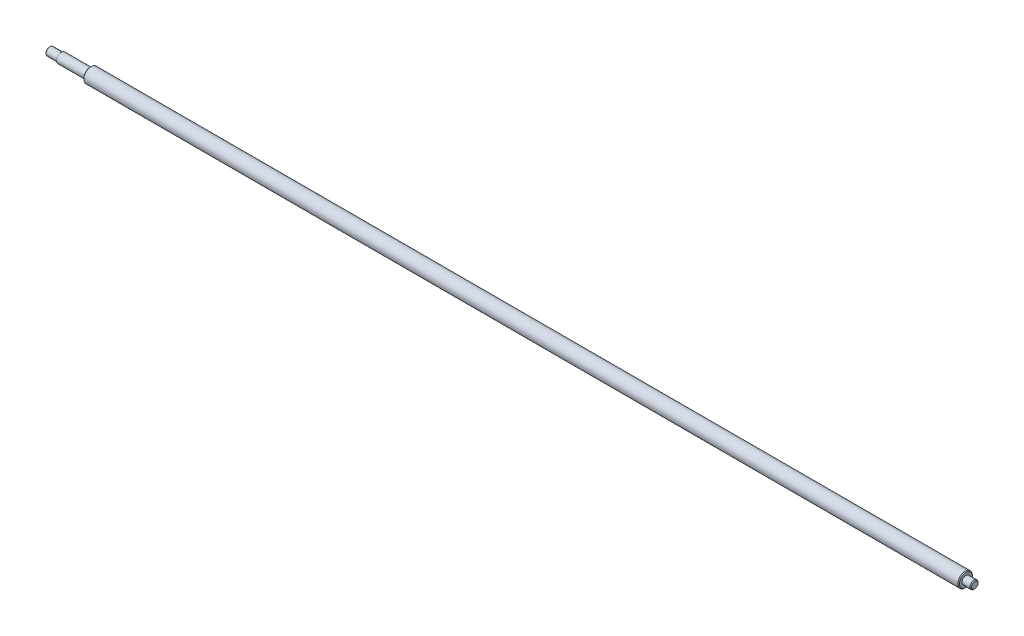
ISO-10303-21;
HEADER;
FILE_DESCRIPTION(('STEP AP214'),'2;1');
FILE_NAME('part.step','',(''),(''),'','','');
FILE_SCHEMA(('AUTOMOTIVE_DESIGN { 1 0 10303 214 1 1 1 1 }'));
ENDSEC;
DATA;
#1=APPLICATION_CONTEXT('core data for automotive mechanical design processes');
#2=APPLICATION_PROTOCOL_DEFINITION('international standard','automotive_design',2000,#1);
#3=PRODUCT_CONTEXT('',#1,'mechanical');
#4=PRODUCT('Part','Part','',(#3));
#5=PRODUCT_RELATED_PRODUCT_CATEGORY('part','',(#4));
#6=PRODUCT_DEFINITION_FORMATION('','',#4);
#7=PRODUCT_DEFINITION_CONTEXT('part definition',#1,'design');
#8=PRODUCT_DEFINITION('design','',#6,#7);
#9=PRODUCT_DEFINITION_SHAPE('','',#8);
#10=(LENGTH_UNIT() NAMED_UNIT(*) SI_UNIT(.MILLI.,.METRE.));
#11=(NAMED_UNIT(*) PLANE_ANGLE_UNIT() SI_UNIT($,.RADIAN.));
#12=(NAMED_UNIT(*) SI_UNIT($,.STERADIAN.) SOLID_ANGLE_UNIT());
#13=UNCERTAINTY_MEASURE_WITH_UNIT(LENGTH_MEASURE(1.E-05),#10,'distance_accuracy_value','');
#14=(GEOMETRIC_REPRESENTATION_CONTEXT(3) GLOBAL_UNCERTAINTY_ASSIGNED_CONTEXT((#13)) GLOBAL_UNIT_ASSIGNED_CONTEXT((#10,
#11,#12)) REPRESENTATION_CONTEXT('',''));
#15=CARTESIAN_POINT('',(0.,0.,0.));
#16=DIRECTION('',(0.,0.,1.));
#17=DIRECTION('',(1.,0.,0.));
#18=AXIS2_PLACEMENT_3D('',#15,#16,#17);
#19=CARTESIAN_POINT('',(-208.466913464529,0.,0.));
#20=DIRECTION('',(1.,0.,0.));
#21=DIRECTION('',(0.,0.,-1.));
#22=AXIS2_PLACEMENT_3D('',#19,#20,#21);
#23=PLANE('',#22);
#24=CARTESIAN_POINT('',(-208.466913464529,0.,0.));
#25=DIRECTION('',(-1.,0.,0.));
#26=DIRECTION('',(0.,0.,1.));
#27=AXIS2_PLACEMENT_3D('',#24,#25,#26);
#28=CIRCLE('',#27,4.);
#29=CARTESIAN_POINT('',(-208.466913464529,0.,4.));
#30=VERTEX_POINT('',#29);
#31=EDGE_CURVE('E10',#30,#30,#28,.T.);
#32=ORIENTED_EDGE('',*,*,#31,.T.);
#33=EDGE_LOOP('',(#32));
#34=FACE_BOUND('',#33,.T.);
#35=ADVANCED_FACE('F30',(#34),#23,.F.);
#36=CARTESIAN_POINT('',(-207.466913464529,0.,0.));
#37=DIRECTION('',(1.,0.,0.));
#38=DIRECTION('',(0.,0.,-1.));
#39=AXIS2_PLACEMENT_3D('',#36,#37,#38);
#40=CONICAL_SURFACE('',#39,5.,0.785398163397448);
#41=ORIENTED_EDGE('',*,*,#31,.F.);
#42=EDGE_LOOP('',(#41));
#43=FACE_BOUND('',#42,.T.);
#44=CARTESIAN_POINT('',(-207.466913464529,0.,0.));
#45=DIRECTION('',(-1.,0.,0.));
#46=DIRECTION('',(0.,0.,1.));
#47=AXIS2_PLACEMENT_3D('',#44,#45,#46);
#48=CIRCLE('',#47,5.);
#49=CARTESIAN_POINT('',(-207.466913464529,0.,5.));
#50=VERTEX_POINT('',#49);
#51=EDGE_CURVE('E36',#50,#50,#48,.T.);
#52=ORIENTED_EDGE('',*,*,#51,.T.);
#53=EDGE_LOOP('',(#52));
#54=FACE_BOUND('',#53,.T.);
#55=ADVANCED_FACE('F86',(#43,#54),#40,.T.);
#56=CARTESIAN_POINT('',(-222.964145739585,0.,0.));
#57=DIRECTION('',(-1.,0.,0.));
#58=DIRECTION('',(0.,0.,1.));
#59=AXIS2_PLACEMENT_3D('',#56,#57,#58);
#60=CYLINDRICAL_SURFACE('',#59,5.);
#61=ORIENTED_EDGE('',*,*,#51,.F.);
#62=EDGE_LOOP('',(#61));
#63=FACE_BOUND('',#62,.T.);
#64=CARTESIAN_POINT('',(-193.466913464529,0.,0.));
#65=DIRECTION('',(-1.,0.,0.));
#66=DIRECTION('',(0.,0.,1.));
#67=AXIS2_PLACEMENT_3D('',#64,#65,#66);
#68=CIRCLE('',#67,5.);
#69=CARTESIAN_POINT('',(-193.466913464529,0.,5.));
#70=VERTEX_POINT('',#69);
#71=EDGE_CURVE('E40',#70,#70,#68,.T.);
#72=ORIENTED_EDGE('',*,*,#71,.T.);
#73=EDGE_LOOP('',(#72));
#74=FACE_BOUND('',#73,.T.);
#75=ADVANCED_FACE('F90',(#63,#74),#60,.T.);
#76=CARTESIAN_POINT('',(-193.466913464529,0.,-5.));
#77=DIRECTION('',(1.,0.,0.));
#78=DIRECTION('',(0.,0.,-1.));
#79=AXIS2_PLACEMENT_3D('',#76,#77,#78);
#80=PLANE('',#79);
#81=ORIENTED_EDGE('',*,*,#71,.F.);
#82=EDGE_LOOP('',(#81));
#83=FACE_BOUND('',#82,.T.);
#84=CARTESIAN_POINT('',(-193.466913464529,0.,0.));
#85=DIRECTION('',(-1.,0.,0.));
#86=DIRECTION('',(0.,0.,1.));
#87=AXIS2_PLACEMENT_3D('',#84,#85,#86);
#88=CIRCLE('',#87,6.);
#89=CARTESIAN_POINT('',(-193.466913464529,0.,6.));
#90=VERTEX_POINT('',#89);
#91=EDGE_CURVE('E44',#90,#90,#88,.T.);
#92=ORIENTED_EDGE('',*,*,#91,.T.);
#93=EDGE_LOOP('',(#92));
#94=FACE_BOUND('',#93,.T.);
#95=ADVANCED_FACE('F95',(#83,#94),#80,.F.);
#96=CARTESIAN_POINT('',(-222.964145739585,0.,0.));
#97=DIRECTION('',(-1.,0.,0.));
#98=DIRECTION('',(0.,0.,1.));
#99=AXIS2_PLACEMENT_3D('',#96,#97,#98);
#100=CYLINDRICAL_SURFACE('',#99,6.);
#101=ORIENTED_EDGE('',*,*,#91,.F.);
#102=EDGE_LOOP('',(#101));
#103=FACE_BOUND('',#102,.T.);
#104=CARTESIAN_POINT('',(-157.466913464529,0.,0.));
#105=DIRECTION('',(-1.,0.,0.));
#106=DIRECTION('',(0.,0.,1.));
#107=AXIS2_PLACEMENT_3D('',#104,#105,#106);
#108=CIRCLE('',#107,6.);
#109=CARTESIAN_POINT('',(-157.466913464529,0.,6.));
#110=VERTEX_POINT('',#109);
#111=EDGE_CURVE('E49',#110,#110,#108,.T.);
#112=ORIENTED_EDGE('',*,*,#111,.T.);
#113=EDGE_LOOP('',(#112));
#114=FACE_BOUND('',#113,.T.);
#115=ADVANCED_FACE('F101',(#103,#114),#100,.T.);
#116=CARTESIAN_POINT('',(-157.466913464529,0.,-6.));
#117=DIRECTION('',(1.,0.,0.));
#118=DIRECTION('',(0.,0.,-1.));
#119=AXIS2_PLACEMENT_3D('',#116,#117,#118);
#120=PLANE('',#119);
#121=ORIENTED_EDGE('',*,*,#111,.F.);
#122=EDGE_LOOP('',(#121));
#123=FACE_BOUND('',#122,.T.);
#124=CARTESIAN_POINT('',(-157.466913464529,0.,0.));
#125=DIRECTION('',(-1.,0.,0.));
#126=DIRECTION('',(0.,0.,1.));
#127=AXIS2_PLACEMENT_3D('',#124,#125,#126);
#128=CIRCLE('',#127,8.);
#129=CARTESIAN_POINT('',(-157.466913464529,0.,8.));
#130=VERTEX_POINT('',#129);
#131=EDGE_CURVE('E52',#130,#130,#128,.T.);
#132=ORIENTED_EDGE('',*,*,#131,.T.);
#133=EDGE_LOOP('',(#132));
#134=FACE_BOUND('',#133,.T.);
#135=ADVANCED_FACE('F105',(#123,#134),#120,.F.);
#136=CARTESIAN_POINT('',(-156.466913464529,0.,0.));
#137=DIRECTION('',(1.,0.,0.));
#138=DIRECTION('',(0.,0.,-1.));
#139=AXIS2_PLACEMENT_3D('',#136,#137,#138);
#140=CONICAL_SURFACE('',#139,9.,0.785398163397447);
#141=ORIENTED_EDGE('',*,*,#131,.F.);
#142=EDGE_LOOP('',(#141));
#143=FACE_BOUND('',#142,.T.);
#144=CARTESIAN_POINT('',(-156.466913464529,0.,0.));
#145=DIRECTION('',(-1.,0.,0.));
#146=DIRECTION('',(0.,0.,1.));
#147=AXIS2_PLACEMENT_3D('',#144,#145,#146);
#148=CIRCLE('',#147,9.);
#149=CARTESIAN_POINT('',(-156.466913464529,0.,9.));
#150=VERTEX_POINT('',#149);
#151=EDGE_CURVE('E55',#150,#150,#148,.T.);
#152=ORIENTED_EDGE('',*,*,#151,.T.);
#153=EDGE_LOOP('',(#152));
#154=FACE_BOUND('',#153,.T.);
#155=ADVANCED_FACE('F109',(#143,#154),#140,.T.);
#156=CARTESIAN_POINT('',(-222.964145739585,0.,0.));
#157=DIRECTION('',(-1.,0.,0.));
#158=DIRECTION('',(0.,0.,1.));
#159=AXIS2_PLACEMENT_3D('',#156,#157,#158);
#160=CYLINDRICAL_SURFACE('',#159,9.);
#161=ORIENTED_EDGE('',*,*,#151,.F.);
#162=EDGE_LOOP('',(#161));
#163=FACE_BOUND('',#162,.T.);
#164=CARTESIAN_POINT('',(929.533086535471,0.,0.));
#165=DIRECTION('',(-1.,0.,0.));
#166=DIRECTION('',(0.,0.,1.));
#167=AXIS2_PLACEMENT_3D('',#164,#165,#166);
#168=CIRCLE('',#167,9.);
#169=CARTESIAN_POINT('',(929.533086535471,0.,9.));
#170=VERTEX_POINT('',#169);
#171=EDGE_CURVE('E58',#170,#170,#168,.T.);
#172=ORIENTED_EDGE('',*,*,#171,.T.);
#173=EDGE_LOOP('',(#172));
#174=FACE_BOUND('',#173,.T.);
#175=ADVANCED_FACE('F113',(#163,#174),#160,.T.);
#176=CARTESIAN_POINT('',(930.533086535471,0.,0.));
#177=DIRECTION('',(-1.,0.,0.));
#178=DIRECTION('',(0.,0.,1.));
#179=AXIS2_PLACEMENT_3D('',#176,#177,#178);
#180=CONICAL_SURFACE('',#179,8.,0.785398163397392);
#181=ORIENTED_EDGE('',*,*,#171,.F.);
#182=EDGE_LOOP('',(#181));
#183=FACE_BOUND('',#182,.T.);
#184=CARTESIAN_POINT('',(930.533086535471,0.,0.));
#185=DIRECTION('',(-1.,0.,0.));
#186=DIRECTION('',(0.,0.,1.));
#187=AXIS2_PLACEMENT_3D('',#184,#185,#186);
#188=CIRCLE('',#187,8.);
#189=CARTESIAN_POINT('',(930.533086535471,0.,8.));
#190=VERTEX_POINT('',#189);
#191=EDGE_CURVE('E61',#190,#190,#188,.T.);
#192=ORIENTED_EDGE('',*,*,#191,.T.);
#193=EDGE_LOOP('',(#192));
#194=FACE_BOUND('',#193,.T.);
#195=ADVANCED_FACE('F117',(#183,#194),#180,.T.);
#196=CARTESIAN_POINT('',(930.533086535471,0.,-8.));
#197=DIRECTION('',(-1.,0.,0.));
#198=DIRECTION('',(0.,0.,1.));
#199=AXIS2_PLACEMENT_3D('',#196,#197,#198);
#200=PLANE('',#199);
#201=ORIENTED_EDGE('',*,*,#191,.F.);
#202=EDGE_LOOP('',(#201));
#203=FACE_BOUND('',#202,.T.);
#204=CARTESIAN_POINT('',(930.533086535471,0.,0.));
#205=DIRECTION('',(-1.,0.,0.));
#206=DIRECTION('',(0.,0.,1.));
#207=AXIS2_PLACEMENT_3D('',#204,#205,#206);
#208=CIRCLE('',#207,5.);
#209=CARTESIAN_POINT('',(930.533086535471,0.,5.));
#210=VERTEX_POINT('',#209);
#211=EDGE_CURVE('E64',#210,#210,#208,.T.);
#212=ORIENTED_EDGE('',*,*,#211,.T.);
#213=EDGE_LOOP('',(#212));
#214=FACE_BOUND('',#213,.T.);
#215=ADVANCED_FACE('F121',(#203,#214),#200,.F.);
#216=CARTESIAN_POINT('',(-222.964145739585,0.,0.));
#217=DIRECTION('',(-1.,0.,0.));
#218=DIRECTION('',(0.,0.,1.));
#219=AXIS2_PLACEMENT_3D('',#216,#217,#218);
#220=CYLINDRICAL_SURFACE('',#219,5.);
#221=ORIENTED_EDGE('',*,*,#211,.F.);
#222=EDGE_LOOP('',(#221));
#223=FACE_BOUND('',#222,.T.);
#224=CARTESIAN_POINT('',(940.533086535471,0.,0.));
#225=DIRECTION('',(-1.,0.,0.));
#226=DIRECTION('',(0.,0.,1.));
#227=AXIS2_PLACEMENT_3D('',#224,#225,#226);
#228=CIRCLE('',#227,5.);
#229=CARTESIAN_POINT('',(940.533086535471,0.,5.));
#230=VERTEX_POINT('',#229);
#231=EDGE_CURVE('E67',#230,#230,#228,.T.);
#232=ORIENTED_EDGE('',*,*,#231,.T.);
#233=EDGE_LOOP('',(#232));
#234=FACE_BOUND('',#233,.T.);
#235=ADVANCED_FACE('F82',(#223,#234),#220,.T.);
#236=CARTESIAN_POINT('',(941.533086535471,0.,0.));
#237=DIRECTION('',(-1.,0.,0.));
#238=DIRECTION('',(0.,0.,1.));
#239=AXIS2_PLACEMENT_3D('',#236,#237,#238);
#240=CONICAL_SURFACE('',#239,4.,0.785398163397503);
#241=ORIENTED_EDGE('',*,*,#231,.F.);
#242=EDGE_LOOP('',(#241));
#243=FACE_BOUND('',#242,.T.);
#244=CARTESIAN_POINT('',(941.533086535471,0.,0.));
#245=DIRECTION('',(-1.,0.,0.));
#246=DIRECTION('',(0.,0.,1.));
#247=AXIS2_PLACEMENT_3D('',#244,#245,#246);
#248=CIRCLE('',#247,4.);
#249=CARTESIAN_POINT('',(941.533086535471,0.,4.));
#250=VERTEX_POINT('',#249);
#251=EDGE_CURVE('E70',#250,#250,#248,.T.);
#252=ORIENTED_EDGE('',*,*,#251,.T.);
#253=EDGE_LOOP('',(#252));
#254=FACE_BOUND('',#253,.T.);
#255=ADVANCED_FACE('F74',(#243,#254),#240,.T.);
#256=CARTESIAN_POINT('',(941.533086535471,0.,-4.));
#257=DIRECTION('',(-1.,0.,0.));
#258=DIRECTION('',(0.,0.,1.));
#259=AXIS2_PLACEMENT_3D('',#256,#257,#258);
#260=PLANE('',#259);
#261=ORIENTED_EDGE('',*,*,#251,.F.);
#262=EDGE_LOOP('',(#261));
#263=FACE_BOUND('',#262,.T.);
#264=ADVANCED_FACE('F76',(#263),#260,.F.);
#265=CLOSED_SHELL('',(#35,#55,#75,#95,#115,#135,#155,#175,#195,#215,#235,#255,#264));
#266=MANIFOLD_SOLID_BREP('B2',#265);
#267=ADVANCED_BREP_SHAPE_REPRESENTATION('',(#18,#266),#14);
#268=SHAPE_DEFINITION_REPRESENTATION(#9,#267);
ENDSEC;
END-ISO-10303-21;
